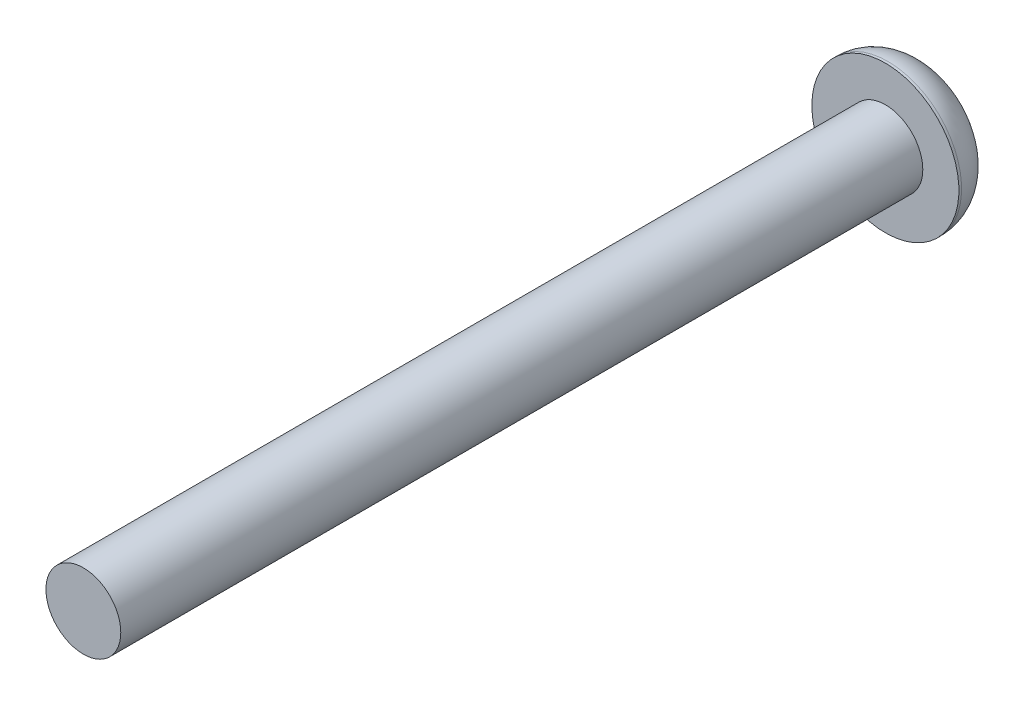
ISO-10303-21;
HEADER;
FILE_DESCRIPTION(('STEP AP214'),'2;1');
FILE_NAME('part.step','',(''),(''),'','','');
FILE_SCHEMA(('AUTOMOTIVE_DESIGN { 1 0 10303 214 1 1 1 1 }'));
ENDSEC;
DATA;
#1=APPLICATION_CONTEXT('core data for automotive mechanical design processes');
#2=APPLICATION_PROTOCOL_DEFINITION('international standard','automotive_design',2000,#1);
#3=PRODUCT_CONTEXT('',#1,'mechanical');
#4=PRODUCT('Part','Part','',(#3));
#5=PRODUCT_RELATED_PRODUCT_CATEGORY('part','',(#4));
#6=PRODUCT_DEFINITION_FORMATION('','',#4);
#7=PRODUCT_DEFINITION_CONTEXT('part definition',#1,'design');
#8=PRODUCT_DEFINITION('design','',#6,#7);
#9=PRODUCT_DEFINITION_SHAPE('','',#8);
#10=(LENGTH_UNIT() NAMED_UNIT(*) SI_UNIT(.MILLI.,.METRE.));
#11=(NAMED_UNIT(*) PLANE_ANGLE_UNIT() SI_UNIT($,.RADIAN.));
#12=(NAMED_UNIT(*) SI_UNIT($,.STERADIAN.) SOLID_ANGLE_UNIT());
#13=UNCERTAINTY_MEASURE_WITH_UNIT(LENGTH_MEASURE(1.E-05),#10,'distance_accuracy_value','');
#14=(GEOMETRIC_REPRESENTATION_CONTEXT(3) GLOBAL_UNCERTAINTY_ASSIGNED_CONTEXT((#13)) GLOBAL_UNIT_ASSIGNED_CONTEXT((#10,
#11,#12)) REPRESENTATION_CONTEXT('',''));
#15=CARTESIAN_POINT('',(0.,0.,0.));
#16=DIRECTION('',(0.,0.,1.));
#17=DIRECTION('',(1.,0.,0.));
#18=AXIS2_PLACEMENT_3D('',#15,#16,#17);
#19=CARTESIAN_POINT('',(0.,0.,30.));
#20=DIRECTION('',(0.,0.,-1.));
#21=DIRECTION('',(-1.,0.,0.));
#22=AXIS2_PLACEMENT_3D('',#19,#20,#21);
#23=CYLINDRICAL_SURFACE('',#22,1.4);
#24=CARTESIAN_POINT('',(0.,0.,30.));
#25=DIRECTION('',(0.,0.,1.));
#26=DIRECTION('',(1.,0.,0.));
#27=AXIS2_PLACEMENT_3D('',#24,#25,#26);
#28=CIRCLE('',#27,1.4);
#29=CARTESIAN_POINT('',(1.4,0.,30.));
#30=VERTEX_POINT('',#29);
#31=EDGE_CURVE('E42',#30,#30,#28,.T.);
#32=ORIENTED_EDGE('',*,*,#31,.F.);
#33=EDGE_LOOP('',(#32));
#34=FACE_BOUND('',#33,.T.);
#35=CARTESIAN_POINT('',(0.,0.,0.));
#36=DIRECTION('',(0.,0.,1.));
#37=DIRECTION('',(1.,0.,0.));
#38=AXIS2_PLACEMENT_3D('',#35,#36,#37);
#39=CIRCLE('',#38,1.4);
#40=CARTESIAN_POINT('',(1.4,0.,0.));
#41=VERTEX_POINT('',#40);
#42=EDGE_CURVE('E46',#41,#41,#39,.T.);
#43=ORIENTED_EDGE('',*,*,#42,.T.);
#44=EDGE_LOOP('',(#43));
#45=FACE_BOUND('',#44,.T.);
#46=ADVANCED_FACE('F31',(#34,#45),#23,.T.);
#47=CARTESIAN_POINT('',(0.,0.,30.));
#48=DIRECTION('',(0.,0.,1.));
#49=DIRECTION('',(1.,0.,0.));
#50=AXIS2_PLACEMENT_3D('',#47,#48,#49);
#51=PLANE('',#50);
#52=ORIENTED_EDGE('',*,*,#31,.T.);
#53=EDGE_LOOP('',(#52));
#54=FACE_BOUND('',#53,.T.);
#55=ADVANCED_FACE('F71',(#54),#51,.T.);
#56=CARTESIAN_POINT('',(0.,0.,-1.6));
#57=DIRECTION('',(0.,0.,1.));
#58=DIRECTION('',(1.,0.,0.));
#59=AXIS2_PLACEMENT_3D('',#56,#57,#58);
#60=CYLINDRICAL_SURFACE('',#59,2.75);
#61=CARTESIAN_POINT('',(0.,0.,-0.1));
#62=DIRECTION('',(0.,0.,-1.));
#63=DIRECTION('',(-1.,0.,0.));
#64=AXIS2_PLACEMENT_3D('',#61,#62,#63);
#65=CIRCLE('',#64,2.75);
#66=CARTESIAN_POINT('',(-2.75,0.,-0.1));
#67=VERTEX_POINT('',#66);
#68=EDGE_CURVE('E10',#67,#67,#65,.F.);
#69=ORIENTED_EDGE('',*,*,#68,.T.);
#70=EDGE_LOOP('',(#69));
#71=FACE_BOUND('',#70,.T.);
#72=CARTESIAN_POINT('',(0.,0.,0.));
#73=DIRECTION('',(0.,0.,-1.));
#74=DIRECTION('',(-1.,0.,0.));
#75=AXIS2_PLACEMENT_3D('',#72,#73,#74);
#76=CIRCLE('',#75,2.75);
#77=CARTESIAN_POINT('',(-2.75,0.,0.));
#78=VERTEX_POINT('',#77);
#79=EDGE_CURVE('E50',#78,#78,#76,.T.);
#80=ORIENTED_EDGE('',*,*,#79,.T.);
#81=EDGE_LOOP('',(#80));
#82=FACE_BOUND('',#81,.T.);
#83=ADVANCED_FACE('F55',(#71,#82),#60,.T.);
#84=CARTESIAN_POINT('',(0.,0.,-1.6));
#85=DIRECTION('',(0.,0.,-1.));
#86=DIRECTION('',(-1.,0.,0.));
#87=AXIS2_PLACEMENT_3D('',#84,#85,#86);
#88=PLANE('',#87);
#89=CARTESIAN_POINT('',(0.,0.,-1.6));
#90=DIRECTION('',(0.,0.,-1.));
#91=DIRECTION('',(-1.,0.,0.));
#92=AXIS2_PLACEMENT_3D('',#89,#90,#91);
#93=CIRCLE('',#92,1.25);
#94=CARTESIAN_POINT('',(-1.25,0.,-1.6));
#95=VERTEX_POINT('',#94);
#96=EDGE_CURVE('E38',#95,#95,#93,.T.);
#97=ORIENTED_EDGE('',*,*,#96,.T.);
#98=EDGE_LOOP('',(#97));
#99=FACE_BOUND('',#98,.T.);
#100=ADVANCED_FACE('F59',(#99),#88,.T.);
#101=CARTESIAN_POINT('',(0.,0.,0.));
#102=DIRECTION('',(0.,0.,-1.));
#103=DIRECTION('',(-1.,0.,0.));
#104=AXIS2_PLACEMENT_3D('',#101,#102,#103);
#105=PLANE('',#104);
#106=ORIENTED_EDGE('',*,*,#42,.F.);
#107=EDGE_LOOP('',(#106));
#108=FACE_BOUND('',#107,.T.);
#109=ORIENTED_EDGE('',*,*,#79,.F.);
#110=EDGE_LOOP('',(#109));
#111=FACE_BOUND('',#110,.T.);
#112=ADVANCED_FACE('F57',(#108,#111),#105,.F.);
#113=CARTESIAN_POINT('',(0.,0.,-0.1));
#114=DIRECTION('',(0.,0.,-1.));
#115=DIRECTION('',(-1.,0.,0.));
#116=AXIS2_PLACEMENT_3D('',#113,#114,#115);
#117=DEGENERATE_TOROIDAL_SURFACE('',#116,1.25,1.5,.T.);
#118=ORIENTED_EDGE('',*,*,#68,.F.);
#119=EDGE_LOOP('',(#118));
#120=FACE_BOUND('',#119,.T.);
#121=ORIENTED_EDGE('',*,*,#96,.F.);
#122=EDGE_LOOP('',(#121));
#123=FACE_BOUND('',#122,.T.);
#124=ADVANCED_FACE('F33',(#120,#123),#117,.T.);
#125=CLOSED_SHELL('',(#46,#55,#83,#100,#112,#124));
#126=MANIFOLD_SOLID_BREP('B2',#125);
#127=ADVANCED_BREP_SHAPE_REPRESENTATION('',(#18,#126),#14);
#128=SHAPE_DEFINITION_REPRESENTATION(#9,#127);
ENDSEC;
END-ISO-10303-21;
